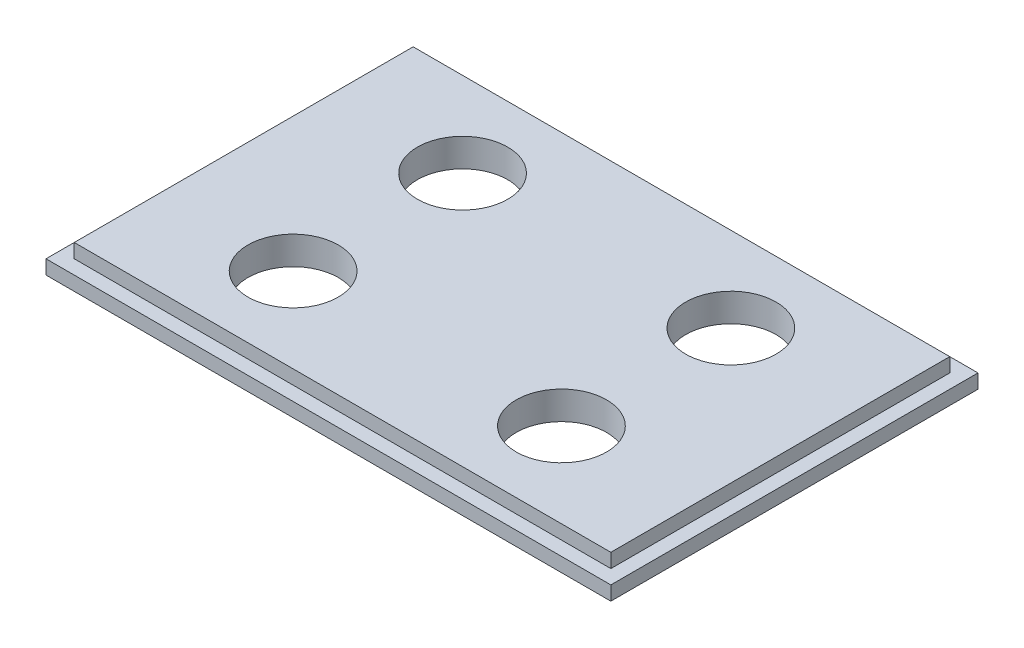
ISO-10303-21;
HEADER;
FILE_DESCRIPTION(('STEP AP214'),'2;1');
FILE_NAME('part.step','',(''),(''),'','','');
FILE_SCHEMA(('AUTOMOTIVE_DESIGN { 1 0 10303 214 1 1 1 1 }'));
ENDSEC;
DATA;
#1=APPLICATION_CONTEXT('core data for automotive mechanical design processes');
#2=APPLICATION_PROTOCOL_DEFINITION('international standard','automotive_design',2000,#1);
#3=PRODUCT_CONTEXT('',#1,'mechanical');
#4=PRODUCT('Part','Part','',(#3));
#5=PRODUCT_RELATED_PRODUCT_CATEGORY('part','',(#4));
#6=PRODUCT_DEFINITION_FORMATION('','',#4);
#7=PRODUCT_DEFINITION_CONTEXT('part definition',#1,'design');
#8=PRODUCT_DEFINITION('design','',#6,#7);
#9=PRODUCT_DEFINITION_SHAPE('','',#8);
#10=(LENGTH_UNIT() NAMED_UNIT(*) SI_UNIT(.MILLI.,.METRE.));
#11=(NAMED_UNIT(*) PLANE_ANGLE_UNIT() SI_UNIT($,.RADIAN.));
#12=(NAMED_UNIT(*) SI_UNIT($,.STERADIAN.) SOLID_ANGLE_UNIT());
#13=UNCERTAINTY_MEASURE_WITH_UNIT(LENGTH_MEASURE(1.E-05),#10,'distance_accuracy_value','');
#14=(GEOMETRIC_REPRESENTATION_CONTEXT(3) GLOBAL_UNCERTAINTY_ASSIGNED_CONTEXT((#13)) GLOBAL_UNIT_ASSIGNED_CONTEXT((#10,
#11,#12)) REPRESENTATION_CONTEXT('',''));
#15=CARTESIAN_POINT('',(0.,0.,0.));
#16=DIRECTION('',(0.,0.,1.));
#17=DIRECTION('',(1.,0.,0.));
#18=AXIS2_PLACEMENT_3D('',#15,#16,#17);
#19=CARTESIAN_POINT('',(0.,6.35,0.));
#20=DIRECTION('',(0.,-1.,0.));
#21=DIRECTION('',(0.,0.,-1.));
#22=AXIS2_PLACEMENT_3D('',#19,#20,#21);
#23=PLANE('',#22);
#24=DIRECTION('',(0.,0.,-1.));
#25=VECTOR('',#24,1.);
#26=CARTESIAN_POINT('',(127.,6.35,82.55));
#27=LINE('',#26,#25);
#28=CARTESIAN_POINT('',(127.,6.35,82.55));
#29=VERTEX_POINT('',#28);
#30=CARTESIAN_POINT('',(127.,6.35,-82.55));
#31=VERTEX_POINT('',#30);
#32=EDGE_CURVE('E145',#29,#31,#27,.T.);
#33=ORIENTED_EDGE('',*,*,#32,.T.);
#34=DIRECTION('',(-1.,0.,0.));
#35=VECTOR('',#34,1.);
#36=CARTESIAN_POINT('',(-127.,6.35,-82.55));
#37=LINE('',#36,#35);
#38=CARTESIAN_POINT('',(-127.,6.35,-82.55));
#39=VERTEX_POINT('',#38);
#40=EDGE_CURVE('E149',#31,#39,#37,.T.);
#41=ORIENTED_EDGE('',*,*,#40,.T.);
#42=DIRECTION('',(0.,0.,1.));
#43=VECTOR('',#42,1.);
#44=CARTESIAN_POINT('',(-127.,6.35,82.55));
#45=LINE('',#44,#43);
#46=CARTESIAN_POINT('',(-127.,6.35,82.55));
#47=VERTEX_POINT('',#46);
#48=EDGE_CURVE('E153',#39,#47,#45,.T.);
#49=ORIENTED_EDGE('',*,*,#48,.T.);
#50=DIRECTION('',(1.,0.,0.));
#51=VECTOR('',#50,1.);
#52=CARTESIAN_POINT('',(-127.,6.35,82.55));
#53=LINE('',#52,#51);
#54=EDGE_CURVE('E156',#47,#29,#53,.T.);
#55=ORIENTED_EDGE('',*,*,#54,.T.);
#56=EDGE_LOOP('',(#33,#41,#49,#55));
#57=FACE_BOUND('',#56,.T.);
#58=DIRECTION('',(0.,0.,-1.));
#59=VECTOR('',#58,1.);
#60=CARTESIAN_POINT('',(120.65,6.35,76.2));
#61=LINE('',#60,#59);
#62=CARTESIAN_POINT('',(120.65,6.35,76.2));
#63=VERTEX_POINT('',#62);
#64=CARTESIAN_POINT('',(120.65,6.35,-76.2));
#65=VERTEX_POINT('',#64);
#66=EDGE_CURVE('E61',#63,#65,#61,.T.);
#67=ORIENTED_EDGE('',*,*,#66,.F.);
#68=DIRECTION('',(1.,0.,0.));
#69=VECTOR('',#68,1.);
#70=CARTESIAN_POINT('',(-120.65,6.35,76.2));
#71=LINE('',#70,#69);
#72=CARTESIAN_POINT('',(-120.65,6.35,76.2));
#73=VERTEX_POINT('',#72);
#74=EDGE_CURVE('E65',#73,#63,#71,.T.);
#75=ORIENTED_EDGE('',*,*,#74,.F.);
#76=DIRECTION('',(0.,0.,1.));
#77=VECTOR('',#76,1.);
#78=CARTESIAN_POINT('',(-120.65,6.35,76.2));
#79=LINE('',#78,#77);
#80=CARTESIAN_POINT('',(-120.65,6.35,-76.2));
#81=VERTEX_POINT('',#80);
#82=EDGE_CURVE('E364',#81,#73,#79,.T.);
#83=ORIENTED_EDGE('',*,*,#82,.F.);
#84=DIRECTION('',(-1.,0.,0.));
#85=VECTOR('',#84,1.);
#86=CARTESIAN_POINT('',(-120.65,6.35,-76.2));
#87=LINE('',#86,#85);
#88=EDGE_CURVE('E361',#65,#81,#87,.T.);
#89=ORIENTED_EDGE('',*,*,#88,.F.);
#90=EDGE_LOOP('',(#67,#75,#83,#89));
#91=FACE_BOUND('',#90,.T.);
#92=ADVANCED_FACE('F45',(#57,#91),#23,.F.);
#93=CARTESIAN_POINT('',(127.,6.35,82.55));
#94=DIRECTION('',(-1.,0.,0.));
#95=DIRECTION('',(0.,0.,1.));
#96=AXIS2_PLACEMENT_3D('',#93,#94,#95);
#97=PLANE('',#96);
#98=DIRECTION('',(0.,0.,-1.));
#99=VECTOR('',#98,1.);
#100=CARTESIAN_POINT('',(127.,0.,82.55));
#101=LINE('',#100,#99);
#102=CARTESIAN_POINT('',(127.,0.,82.55));
#103=VERTEX_POINT('',#102);
#104=CARTESIAN_POINT('',(127.,0.,-82.55));
#105=VERTEX_POINT('',#104);
#106=EDGE_CURVE('E134',#103,#105,#101,.T.);
#107=ORIENTED_EDGE('',*,*,#106,.T.);
#108=DIRECTION('',(0.,-1.,0.));
#109=VECTOR('',#108,1.);
#110=CARTESIAN_POINT('',(127.,6.35,-82.55));
#111=LINE('',#110,#109);
#112=EDGE_CURVE('E11',#31,#105,#111,.T.);
#113=ORIENTED_EDGE('',*,*,#112,.F.);
#114=ORIENTED_EDGE('',*,*,#32,.F.);
#115=DIRECTION('',(0.,-1.,0.));
#116=VECTOR('',#115,1.);
#117=CARTESIAN_POINT('',(127.,6.35,82.55));
#118=LINE('',#117,#116);
#119=EDGE_CURVE('E158',#29,#103,#118,.T.);
#120=ORIENTED_EDGE('',*,*,#119,.T.);
#121=EDGE_LOOP('',(#107,#113,#114,#120));
#122=FACE_BOUND('',#121,.T.);
#123=ADVANCED_FACE('F47',(#122),#97,.F.);
#124=CARTESIAN_POINT('',(-127.,6.35,-82.55));
#125=DIRECTION('',(0.,0.,1.));
#126=DIRECTION('',(1.,0.,0.));
#127=AXIS2_PLACEMENT_3D('',#124,#125,#126);
#128=PLANE('',#127);
#129=DIRECTION('',(-1.,0.,0.));
#130=VECTOR('',#129,1.);
#131=CARTESIAN_POINT('',(-127.,0.,-82.55));
#132=LINE('',#131,#130);
#133=CARTESIAN_POINT('',(-127.,0.,-82.55));
#134=VERTEX_POINT('',#133);
#135=EDGE_CURVE('E139',#105,#134,#132,.T.);
#136=ORIENTED_EDGE('',*,*,#135,.T.);
#137=DIRECTION('',(0.,-1.,0.));
#138=VECTOR('',#137,1.);
#139=CARTESIAN_POINT('',(-127.,6.35,-82.55));
#140=LINE('',#139,#138);
#141=EDGE_CURVE('E54',#39,#134,#140,.T.);
#142=ORIENTED_EDGE('',*,*,#141,.F.);
#143=ORIENTED_EDGE('',*,*,#40,.F.);
#144=ORIENTED_EDGE('',*,*,#112,.T.);
#145=EDGE_LOOP('',(#136,#142,#143,#144));
#146=FACE_BOUND('',#145,.T.);
#147=ADVANCED_FACE('F194',(#146),#128,.F.);
#148=CARTESIAN_POINT('',(-127.,6.35,82.55));
#149=DIRECTION('',(1.,0.,0.));
#150=DIRECTION('',(0.,0.,-1.));
#151=AXIS2_PLACEMENT_3D('',#148,#149,#150);
#152=PLANE('',#151);
#153=DIRECTION('',(0.,0.,1.));
#154=VECTOR('',#153,1.);
#155=CARTESIAN_POINT('',(-127.,0.,82.55));
#156=LINE('',#155,#154);
#157=CARTESIAN_POINT('',(-127.,0.,82.55));
#158=VERTEX_POINT('',#157);
#159=EDGE_CURVE('E162',#134,#158,#156,.T.);
#160=ORIENTED_EDGE('',*,*,#159,.T.);
#161=DIRECTION('',(0.,-1.,0.));
#162=VECTOR('',#161,1.);
#163=CARTESIAN_POINT('',(-127.,6.35,82.55));
#164=LINE('',#163,#162);
#165=EDGE_CURVE('E170',#47,#158,#164,.T.);
#166=ORIENTED_EDGE('',*,*,#165,.F.);
#167=ORIENTED_EDGE('',*,*,#48,.F.);
#168=ORIENTED_EDGE('',*,*,#141,.T.);
#169=EDGE_LOOP('',(#160,#166,#167,#168));
#170=FACE_BOUND('',#169,.T.);
#171=ADVANCED_FACE('F179',(#170),#152,.F.);
#172=CARTESIAN_POINT('',(-127.,6.35,82.55));
#173=DIRECTION('',(0.,0.,-1.));
#174=DIRECTION('',(-1.,0.,0.));
#175=AXIS2_PLACEMENT_3D('',#172,#173,#174);
#176=PLANE('',#175);
#177=DIRECTION('',(1.,0.,0.));
#178=VECTOR('',#177,1.);
#179=CARTESIAN_POINT('',(-127.,0.,82.55));
#180=LINE('',#179,#178);
#181=EDGE_CURVE('E150',#158,#103,#180,.T.);
#182=ORIENTED_EDGE('',*,*,#181,.T.);
#183=ORIENTED_EDGE('',*,*,#119,.F.);
#184=ORIENTED_EDGE('',*,*,#54,.F.);
#185=ORIENTED_EDGE('',*,*,#165,.T.);
#186=EDGE_LOOP('',(#182,#183,#184,#185));
#187=FACE_BOUND('',#186,.T.);
#188=ADVANCED_FACE('F188',(#187),#176,.F.);
#189=CARTESIAN_POINT('',(0.,0.,0.));
#190=DIRECTION('',(0.,-1.,0.));
#191=DIRECTION('',(0.,0.,-1.));
#192=AXIS2_PLACEMENT_3D('',#189,#190,#191);
#193=PLANE('',#192);
#194=CARTESIAN_POINT('',(-60.3249999999999,0.,38.1));
#195=DIRECTION('',(0.,1.,0.));
#196=DIRECTION('',(0.,0.,-1.));
#197=AXIS2_PLACEMENT_3D('',#194,#195,#196);
#198=CIRCLE('',#197,20.32);
#199=CARTESIAN_POINT('',(-60.3249999999999,0.,17.78));
#200=VERTEX_POINT('',#199);
#201=EDGE_CURVE('E330',#200,#200,#198,.T.);
#202=ORIENTED_EDGE('',*,*,#201,.T.);
#203=EDGE_LOOP('',(#202));
#204=FACE_BOUND('',#203,.T.);
#205=CARTESIAN_POINT('',(60.325,0.,38.1));
#206=DIRECTION('',(0.,1.,0.));
#207=DIRECTION('',(0.,0.,1.));
#208=AXIS2_PLACEMENT_3D('',#205,#206,#207);
#209=CIRCLE('',#208,20.32);
#210=CARTESIAN_POINT('',(60.325,0.,58.42));
#211=VERTEX_POINT('',#210);
#212=EDGE_CURVE('E335',#211,#211,#209,.T.);
#213=ORIENTED_EDGE('',*,*,#212,.T.);
#214=EDGE_LOOP('',(#213));
#215=FACE_BOUND('',#214,.T.);
#216=CARTESIAN_POINT('',(60.325,0.,-38.1));
#217=DIRECTION('',(0.,1.,0.));
#218=DIRECTION('',(0.,0.,-1.));
#219=AXIS2_PLACEMENT_3D('',#216,#217,#218);
#220=CIRCLE('',#219,20.32);
#221=CARTESIAN_POINT('',(60.325,0.,-58.42));
#222=VERTEX_POINT('',#221);
#223=EDGE_CURVE('E376',#222,#222,#220,.T.);
#224=ORIENTED_EDGE('',*,*,#223,.T.);
#225=EDGE_LOOP('',(#224));
#226=FACE_BOUND('',#225,.T.);
#227=CARTESIAN_POINT('',(-60.325,0.,-38.1));
#228=DIRECTION('',(0.,1.,0.));
#229=DIRECTION('',(0.,0.,1.));
#230=AXIS2_PLACEMENT_3D('',#227,#228,#229);
#231=CIRCLE('',#230,20.32);
#232=CARTESIAN_POINT('',(-60.325,0.,-17.78));
#233=VERTEX_POINT('',#232);
#234=EDGE_CURVE('E345',#233,#233,#231,.T.);
#235=ORIENTED_EDGE('',*,*,#234,.T.);
#236=EDGE_LOOP('',(#235));
#237=FACE_BOUND('',#236,.T.);
#238=ORIENTED_EDGE('',*,*,#106,.F.);
#239=ORIENTED_EDGE('',*,*,#181,.F.);
#240=ORIENTED_EDGE('',*,*,#159,.F.);
#241=ORIENTED_EDGE('',*,*,#135,.F.);
#242=EDGE_LOOP('',(#238,#239,#240,#241));
#243=FACE_BOUND('',#242,.T.);
#244=ADVANCED_FACE('F185',(#204,#215,#226,#237,#243),#193,.T.);
#245=CARTESIAN_POINT('',(120.65,12.7,76.2));
#246=DIRECTION('',(-1.,0.,0.));
#247=DIRECTION('',(0.,0.,1.));
#248=AXIS2_PLACEMENT_3D('',#245,#246,#247);
#249=PLANE('',#248);
#250=ORIENTED_EDGE('',*,*,#66,.T.);
#251=DIRECTION('',(0.,-1.,0.));
#252=VECTOR('',#251,1.);
#253=CARTESIAN_POINT('',(120.65,12.7,-76.2));
#254=LINE('',#253,#252);
#255=CARTESIAN_POINT('',(120.65,12.7,-76.2));
#256=VERTEX_POINT('',#255);
#257=EDGE_CURVE('E114',#256,#65,#254,.T.);
#258=ORIENTED_EDGE('',*,*,#257,.F.);
#259=DIRECTION('',(0.,0.,-1.));
#260=VECTOR('',#259,1.);
#261=CARTESIAN_POINT('',(120.65,12.7,76.2));
#262=LINE('',#261,#260);
#263=CARTESIAN_POINT('',(120.65,12.7,76.2));
#264=VERTEX_POINT('',#263);
#265=EDGE_CURVE('E121',#264,#256,#262,.T.);
#266=ORIENTED_EDGE('',*,*,#265,.F.);
#267=DIRECTION('',(0.,-1.,0.));
#268=VECTOR('',#267,1.);
#269=CARTESIAN_POINT('',(120.65,12.7,76.2));
#270=LINE('',#269,#268);
#271=EDGE_CURVE('E358',#264,#63,#270,.T.);
#272=ORIENTED_EDGE('',*,*,#271,.T.);
#273=EDGE_LOOP('',(#250,#258,#266,#272));
#274=FACE_BOUND('',#273,.T.);
#275=ADVANCED_FACE('F132',(#274),#249,.F.);
#276=CARTESIAN_POINT('',(-120.65,12.7,-76.2));
#277=DIRECTION('',(0.,0.,1.));
#278=DIRECTION('',(1.,0.,0.));
#279=AXIS2_PLACEMENT_3D('',#276,#277,#278);
#280=PLANE('',#279);
#281=ORIENTED_EDGE('',*,*,#88,.T.);
#282=DIRECTION('',(0.,-1.,0.));
#283=VECTOR('',#282,1.);
#284=CARTESIAN_POINT('',(-120.65,12.7,-76.2));
#285=LINE('',#284,#283);
#286=CARTESIAN_POINT('',(-120.65,12.7,-76.2));
#287=VERTEX_POINT('',#286);
#288=EDGE_CURVE('E116',#287,#81,#285,.T.);
#289=ORIENTED_EDGE('',*,*,#288,.F.);
#290=DIRECTION('',(-1.,0.,0.));
#291=VECTOR('',#290,1.);
#292=CARTESIAN_POINT('',(-120.65,12.7,-76.2));
#293=LINE('',#292,#291);
#294=EDGE_CURVE('E109',#256,#287,#293,.T.);
#295=ORIENTED_EDGE('',*,*,#294,.F.);
#296=ORIENTED_EDGE('',*,*,#257,.T.);
#297=EDGE_LOOP('',(#281,#289,#295,#296));
#298=FACE_BOUND('',#297,.T.);
#299=ADVANCED_FACE('F112',(#298),#280,.F.);
#300=CARTESIAN_POINT('',(-120.65,12.7,76.2));
#301=DIRECTION('',(1.,0.,0.));
#302=DIRECTION('',(0.,0.,-1.));
#303=AXIS2_PLACEMENT_3D('',#300,#301,#302);
#304=PLANE('',#303);
#305=ORIENTED_EDGE('',*,*,#82,.T.);
#306=DIRECTION('',(0.,-1.,0.));
#307=VECTOR('',#306,1.);
#308=CARTESIAN_POINT('',(-120.65,12.7,76.2));
#309=LINE('',#308,#307);
#310=CARTESIAN_POINT('',(-120.65,12.7,76.2));
#311=VERTEX_POINT('',#310);
#312=EDGE_CURVE('E141',#311,#73,#309,.T.);
#313=ORIENTED_EDGE('',*,*,#312,.F.);
#314=DIRECTION('',(0.,0.,1.));
#315=VECTOR('',#314,1.);
#316=CARTESIAN_POINT('',(-120.65,12.7,76.2));
#317=LINE('',#316,#315);
#318=EDGE_CURVE('E120',#287,#311,#317,.T.);
#319=ORIENTED_EDGE('',*,*,#318,.F.);
#320=ORIENTED_EDGE('',*,*,#288,.T.);
#321=EDGE_LOOP('',(#305,#313,#319,#320));
#322=FACE_BOUND('',#321,.T.);
#323=ADVANCED_FACE('F254',(#322),#304,.F.);
#324=CARTESIAN_POINT('',(-120.65,12.7,76.2));
#325=DIRECTION('',(0.,0.,-1.));
#326=DIRECTION('',(-1.,0.,0.));
#327=AXIS2_PLACEMENT_3D('',#324,#325,#326);
#328=PLANE('',#327);
#329=ORIENTED_EDGE('',*,*,#74,.T.);
#330=ORIENTED_EDGE('',*,*,#271,.F.);
#331=DIRECTION('',(1.,0.,0.));
#332=VECTOR('',#331,1.);
#333=CARTESIAN_POINT('',(-120.65,12.7,76.2));
#334=LINE('',#333,#332);
#335=EDGE_CURVE('E126',#311,#264,#334,.T.);
#336=ORIENTED_EDGE('',*,*,#335,.F.);
#337=ORIENTED_EDGE('',*,*,#312,.T.);
#338=EDGE_LOOP('',(#329,#330,#336,#337));
#339=FACE_BOUND('',#338,.T.);
#340=ADVANCED_FACE('F261',(#339),#328,.F.);
#341=CARTESIAN_POINT('',(0.,12.7,0.));
#342=DIRECTION('',(0.,-1.,0.));
#343=DIRECTION('',(0.,0.,-1.));
#344=AXIS2_PLACEMENT_3D('',#341,#342,#343);
#345=PLANE('',#344);
#346=CARTESIAN_POINT('',(-60.3249999999999,12.7,38.1));
#347=DIRECTION('',(0.,1.,0.));
#348=DIRECTION('',(0.,0.,-1.));
#349=AXIS2_PLACEMENT_3D('',#346,#347,#348);
#350=CIRCLE('',#349,20.32);
#351=CARTESIAN_POINT('',(-60.3249999999999,12.7,17.78));
#352=VERTEX_POINT('',#351);
#353=EDGE_CURVE('E333',#352,#352,#350,.T.);
#354=ORIENTED_EDGE('',*,*,#353,.F.);
#355=EDGE_LOOP('',(#354));
#356=FACE_BOUND('',#355,.T.);
#357=CARTESIAN_POINT('',(60.325,12.7,38.1));
#358=DIRECTION('',(0.,1.,0.));
#359=DIRECTION('',(0.,0.,1.));
#360=AXIS2_PLACEMENT_3D('',#357,#358,#359);
#361=CIRCLE('',#360,20.32);
#362=CARTESIAN_POINT('',(60.325,12.7,58.42));
#363=VERTEX_POINT('',#362);
#364=EDGE_CURVE('E340',#363,#363,#361,.T.);
#365=ORIENTED_EDGE('',*,*,#364,.F.);
#366=EDGE_LOOP('',(#365));
#367=FACE_BOUND('',#366,.T.);
#368=CARTESIAN_POINT('',(60.325,12.7,-38.1));
#369=DIRECTION('',(0.,1.,0.));
#370=DIRECTION('',(0.,0.,-1.));
#371=AXIS2_PLACEMENT_3D('',#368,#369,#370);
#372=CIRCLE('',#371,20.32);
#373=CARTESIAN_POINT('',(60.325,12.7,-58.42));
#374=VERTEX_POINT('',#373);
#375=EDGE_CURVE('E352',#374,#374,#372,.T.);
#376=ORIENTED_EDGE('',*,*,#375,.F.);
#377=EDGE_LOOP('',(#376));
#378=FACE_BOUND('',#377,.T.);
#379=CARTESIAN_POINT('',(-60.325,12.7,-38.1));
#380=DIRECTION('',(0.,1.,0.));
#381=DIRECTION('',(0.,0.,1.));
#382=AXIS2_PLACEMENT_3D('',#379,#380,#381);
#383=CIRCLE('',#382,20.32);
#384=CARTESIAN_POINT('',(-60.325,12.7,-17.78));
#385=VERTEX_POINT('',#384);
#386=EDGE_CURVE('E349',#385,#385,#383,.T.);
#387=ORIENTED_EDGE('',*,*,#386,.F.);
#388=EDGE_LOOP('',(#387));
#389=FACE_BOUND('',#388,.T.);
#390=ORIENTED_EDGE('',*,*,#265,.T.);
#391=ORIENTED_EDGE('',*,*,#294,.T.);
#392=ORIENTED_EDGE('',*,*,#318,.T.);
#393=ORIENTED_EDGE('',*,*,#335,.T.);
#394=EDGE_LOOP('',(#390,#391,#392,#393));
#395=FACE_BOUND('',#394,.T.);
#396=ADVANCED_FACE('F124',(#356,#367,#378,#389,#395),#345,.F.);
#397=CARTESIAN_POINT('',(-60.325,0.,-38.1));
#398=DIRECTION('',(0.,1.,0.));
#399=DIRECTION('',(0.,0.,1.));
#400=AXIS2_PLACEMENT_3D('',#397,#398,#399);
#401=CYLINDRICAL_SURFACE('',#400,20.32);
#402=ORIENTED_EDGE('',*,*,#234,.F.);
#403=EDGE_LOOP('',(#402));
#404=FACE_BOUND('',#403,.T.);
#405=ORIENTED_EDGE('',*,*,#386,.T.);
#406=EDGE_LOOP('',(#405));
#407=FACE_BOUND('',#406,.T.);
#408=ADVANCED_FACE('F278',(#404,#407),#401,.F.);
#409=CARTESIAN_POINT('',(60.325,0.,-38.1));
#410=DIRECTION('',(0.,1.,0.));
#411=DIRECTION('',(0.,0.,1.));
#412=AXIS2_PLACEMENT_3D('',#409,#410,#411);
#413=CYLINDRICAL_SURFACE('',#412,20.32);
#414=ORIENTED_EDGE('',*,*,#223,.F.);
#415=EDGE_LOOP('',(#414));
#416=FACE_BOUND('',#415,.T.);
#417=ORIENTED_EDGE('',*,*,#375,.T.);
#418=EDGE_LOOP('',(#417));
#419=FACE_BOUND('',#418,.T.);
#420=ADVANCED_FACE('F287',(#416,#419),#413,.F.);
#421=CARTESIAN_POINT('',(60.325,0.,38.1));
#422=DIRECTION('',(0.,1.,0.));
#423=DIRECTION('',(0.,0.,1.));
#424=AXIS2_PLACEMENT_3D('',#421,#422,#423);
#425=CYLINDRICAL_SURFACE('',#424,20.32);
#426=ORIENTED_EDGE('',*,*,#212,.F.);
#427=EDGE_LOOP('',(#426));
#428=FACE_BOUND('',#427,.T.);
#429=ORIENTED_EDGE('',*,*,#364,.T.);
#430=EDGE_LOOP('',(#429));
#431=FACE_BOUND('',#430,.T.);
#432=ADVANCED_FACE('F296',(#428,#431),#425,.F.);
#433=CARTESIAN_POINT('',(-60.3249999999999,0.,38.1));
#434=DIRECTION('',(0.,1.,0.));
#435=DIRECTION('',(0.,0.,1.));
#436=AXIS2_PLACEMENT_3D('',#433,#434,#435);
#437=CYLINDRICAL_SURFACE('',#436,20.32);
#438=ORIENTED_EDGE('',*,*,#201,.F.);
#439=EDGE_LOOP('',(#438));
#440=FACE_BOUND('',#439,.T.);
#441=ORIENTED_EDGE('',*,*,#353,.T.);
#442=EDGE_LOOP('',(#441));
#443=FACE_BOUND('',#442,.T.);
#444=ADVANCED_FACE('F305',(#440,#443),#437,.F.);
#445=CLOSED_SHELL('',(#92,#123,#147,#171,#188,#244,#275,#299,#323,#340,#396,#408,#420,#432,#444));
#446=MANIFOLD_SOLID_BREP('B2',#445);
#447=ADVANCED_BREP_SHAPE_REPRESENTATION('',(#18,#446),#14);
#448=SHAPE_DEFINITION_REPRESENTATION(#9,#447);
ENDSEC;
END-ISO-10303-21;
